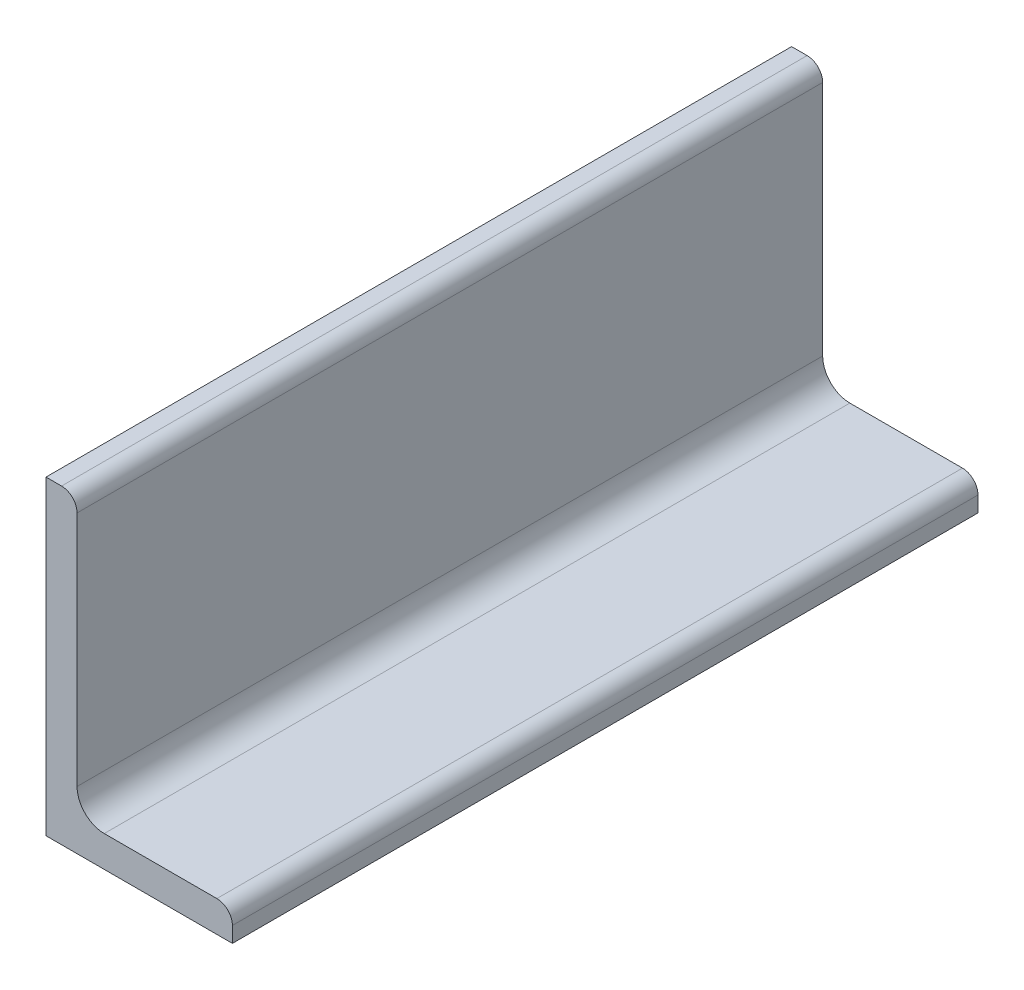
ISO-10303-21;
HEADER;
FILE_DESCRIPTION(('STEP AP214'),'2;1');
FILE_NAME('part.step','',(''),(''),'','','');
FILE_SCHEMA(('AUTOMOTIVE_DESIGN { 1 0 10303 214 1 1 1 1 }'));
ENDSEC;
DATA;
#1=APPLICATION_CONTEXT('core data for automotive mechanical design processes');
#2=APPLICATION_PROTOCOL_DEFINITION('international standard','automotive_design',2000,#1);
#3=PRODUCT_CONTEXT('',#1,'mechanical');
#4=PRODUCT('Part','Part','',(#3));
#5=PRODUCT_RELATED_PRODUCT_CATEGORY('part','',(#4));
#6=PRODUCT_DEFINITION_FORMATION('','',#4);
#7=PRODUCT_DEFINITION_CONTEXT('part definition',#1,'design');
#8=PRODUCT_DEFINITION('design','',#6,#7);
#9=PRODUCT_DEFINITION_SHAPE('','',#8);
#10=(LENGTH_UNIT() NAMED_UNIT(*) SI_UNIT(.MILLI.,.METRE.));
#11=(NAMED_UNIT(*) PLANE_ANGLE_UNIT() SI_UNIT($,.RADIAN.));
#12=(NAMED_UNIT(*) SI_UNIT($,.STERADIAN.) SOLID_ANGLE_UNIT());
#13=UNCERTAINTY_MEASURE_WITH_UNIT(LENGTH_MEASURE(1.E-05),#10,'distance_accuracy_value','');
#14=(GEOMETRIC_REPRESENTATION_CONTEXT(3) GLOBAL_UNCERTAINTY_ASSIGNED_CONTEXT((#13)) GLOBAL_UNIT_ASSIGNED_CONTEXT((#10,
#11,#12)) REPRESENTATION_CONTEXT('',''));
#15=CARTESIAN_POINT('',(0.,0.,0.));
#16=DIRECTION('',(0.,0.,1.));
#17=DIRECTION('',(1.,0.,0.));
#18=AXIS2_PLACEMENT_3D('',#15,#16,#17);
#19=CARTESIAN_POINT('',(0.490776827053332,127.041655270204,304.8));
#20=DIRECTION('',(1.,0.,0.));
#21=DIRECTION('',(0.,0.,-1.));
#22=AXIS2_PLACEMENT_3D('',#19,#20,#21);
#23=PLANE('',#22);
#24=DIRECTION('',(0.,-1.,0.));
#25=VECTOR('',#24,1.);
#26=CARTESIAN_POINT('',(0.490776827053332,127.041655270204,0.));
#27=LINE('',#26,#25);
#28=CARTESIAN_POINT('',(0.490776827053332,127.041655270204,0.));
#29=VERTEX_POINT('',#28);
#30=CARTESIAN_POINT('',(0.490776827053332,0.0416552702040917,0.));
#31=VERTEX_POINT('',#30);
#32=EDGE_CURVE('E135',#29,#31,#27,.T.);
#33=ORIENTED_EDGE('',*,*,#32,.T.);
#34=DIRECTION('',(0.,0.,-1.));
#35=VECTOR('',#34,1.);
#36=CARTESIAN_POINT('',(0.490776827053332,0.0416552702040917,304.8));
#37=LINE('',#36,#35);
#38=CARTESIAN_POINT('',(0.490776827053332,0.0416552702040917,304.8));
#39=VERTEX_POINT('',#38);
#40=EDGE_CURVE('E11',#39,#31,#37,.T.);
#41=ORIENTED_EDGE('',*,*,#40,.F.);
#42=DIRECTION('',(0.,-1.,0.));
#43=VECTOR('',#42,1.);
#44=CARTESIAN_POINT('',(0.490776827053332,127.041655270204,304.8));
#45=LINE('',#44,#43);
#46=CARTESIAN_POINT('',(0.490776827053332,127.041655270204,304.8));
#47=VERTEX_POINT('',#46);
#48=EDGE_CURVE('E151',#47,#39,#45,.T.);
#49=ORIENTED_EDGE('',*,*,#48,.F.);
#50=DIRECTION('',(0.,0.,-1.));
#51=VECTOR('',#50,1.);
#52=CARTESIAN_POINT('',(0.490776827053332,127.041655270204,304.8));
#53=LINE('',#52,#51);
#54=EDGE_CURVE('E131',#47,#29,#53,.T.);
#55=ORIENTED_EDGE('',*,*,#54,.T.);
#56=EDGE_LOOP('',(#33,#41,#49,#55));
#57=FACE_BOUND('',#56,.T.);
#58=ADVANCED_FACE('F33',(#57),#23,.F.);
#59=CARTESIAN_POINT('',(0.490776827053332,0.0416552702040917,304.8));
#60=DIRECTION('',(0.,1.,0.));
#61=DIRECTION('',(0.,0.,1.));
#62=AXIS2_PLACEMENT_3D('',#59,#60,#61);
#63=PLANE('',#62);
#64=DIRECTION('',(1.,0.,0.));
#65=VECTOR('',#64,1.);
#66=CARTESIAN_POINT('',(0.490776827053332,0.0416552702040917,0.));
#67=LINE('',#66,#65);
#68=CARTESIAN_POINT('',(76.6907768270533,0.0416552702040917,0.));
#69=VERTEX_POINT('',#68);
#70=EDGE_CURVE('E138',#31,#69,#67,.T.);
#71=ORIENTED_EDGE('',*,*,#70,.T.);
#72=DIRECTION('',(0.,0.,-1.));
#73=VECTOR('',#72,1.);
#74=CARTESIAN_POINT('',(76.6907768270533,0.0416552702040917,304.8));
#75=LINE('',#74,#73);
#76=CARTESIAN_POINT('',(76.6907768270533,0.0416552702040917,304.8));
#77=VERTEX_POINT('',#76);
#78=EDGE_CURVE('E41',#77,#69,#75,.T.);
#79=ORIENTED_EDGE('',*,*,#78,.F.);
#80=DIRECTION('',(1.,0.,0.));
#81=VECTOR('',#80,1.);
#82=CARTESIAN_POINT('',(0.490776827053332,0.0416552702040917,304.8));
#83=LINE('',#82,#81);
#84=EDGE_CURVE('E95',#39,#77,#83,.T.);
#85=ORIENTED_EDGE('',*,*,#84,.F.);
#86=ORIENTED_EDGE('',*,*,#40,.T.);
#87=EDGE_LOOP('',(#71,#79,#85,#86));
#88=FACE_BOUND('',#87,.T.);
#89=ADVANCED_FACE('F194',(#88),#63,.F.);
#90=CARTESIAN_POINT('',(76.6907768270533,0.0416552702040917,304.8));
#91=DIRECTION('',(-1.,0.,0.));
#92=DIRECTION('',(0.,0.,1.));
#93=AXIS2_PLACEMENT_3D('',#90,#91,#92);
#94=PLANE('',#93);
#95=DIRECTION('',(0.,1.,0.));
#96=VECTOR('',#95,1.);
#97=CARTESIAN_POINT('',(76.6907768270533,0.0416552702040917,0.));
#98=LINE('',#97,#96);
#99=CARTESIAN_POINT('',(76.6907768270533,6.39165527020409,0.));
#100=VERTEX_POINT('',#99);
#101=EDGE_CURVE('E140',#69,#100,#98,.T.);
#102=ORIENTED_EDGE('',*,*,#101,.T.);
#103=DIRECTION('',(0.,0.,-1.));
#104=VECTOR('',#103,1.);
#105=CARTESIAN_POINT('',(76.6907768270533,6.39165527020409,304.8));
#106=LINE('',#105,#104);
#107=CARTESIAN_POINT('',(76.6907768270533,6.39165527020409,304.8));
#108=VERTEX_POINT('',#107);
#109=EDGE_CURVE('E161',#108,#100,#106,.T.);
#110=ORIENTED_EDGE('',*,*,#109,.F.);
#111=DIRECTION('',(0.,1.,0.));
#112=VECTOR('',#111,1.);
#113=CARTESIAN_POINT('',(76.6907768270533,0.0416552702040917,304.8));
#114=LINE('',#113,#112);
#115=EDGE_CURVE('E169',#77,#108,#114,.T.);
#116=ORIENTED_EDGE('',*,*,#115,.F.);
#117=ORIENTED_EDGE('',*,*,#78,.T.);
#118=EDGE_LOOP('',(#102,#110,#116,#117));
#119=FACE_BOUND('',#118,.T.);
#120=ADVANCED_FACE('F167',(#119),#94,.F.);
#121=CARTESIAN_POINT('',(70.3407768270533,6.39165527020409,304.8));
#122=DIRECTION('',(0.,0.,-1.));
#123=DIRECTION('',(-1.,0.,0.));
#124=AXIS2_PLACEMENT_3D('',#121,#122,#123);
#125=CYLINDRICAL_SURFACE('',#124,6.35);
#126=CARTESIAN_POINT('',(70.3407768270533,6.39165527020409,0.));
#127=DIRECTION('',(0.,0.,1.));
#128=DIRECTION('',(1.,0.,0.));
#129=AXIS2_PLACEMENT_3D('',#126,#127,#128);
#130=CIRCLE('',#129,6.35);
#131=CARTESIAN_POINT('',(70.3407768270533,12.7416552702041,0.));
#132=VERTEX_POINT('',#131);
#133=EDGE_CURVE('E142',#100,#132,#130,.T.);
#134=ORIENTED_EDGE('',*,*,#133,.T.);
#135=DIRECTION('',(0.,0.,-1.));
#136=VECTOR('',#135,1.);
#137=CARTESIAN_POINT('',(70.3407768270533,12.7416552702041,304.8));
#138=LINE('',#137,#136);
#139=CARTESIAN_POINT('',(70.3407768270533,12.7416552702041,304.8));
#140=VERTEX_POINT('',#139);
#141=EDGE_CURVE('E158',#140,#132,#138,.T.);
#142=ORIENTED_EDGE('',*,*,#141,.F.);
#143=CARTESIAN_POINT('',(70.3407768270533,6.39165527020409,304.8));
#144=DIRECTION('',(0.,0.,1.));
#145=DIRECTION('',(1.,0.,0.));
#146=AXIS2_PLACEMENT_3D('',#143,#144,#145);
#147=CIRCLE('',#146,6.35);
#148=EDGE_CURVE('E185',#108,#140,#147,.T.);
#149=ORIENTED_EDGE('',*,*,#148,.F.);
#150=ORIENTED_EDGE('',*,*,#109,.T.);
#151=EDGE_LOOP('',(#134,#142,#149,#150));
#152=FACE_BOUND('',#151,.T.);
#153=ADVANCED_FACE('F178',(#152),#125,.T.);
#154=CARTESIAN_POINT('',(70.3407768270533,12.7416552702041,304.8));
#155=DIRECTION('',(0.,-1.,0.));
#156=DIRECTION('',(0.,0.,-1.));
#157=AXIS2_PLACEMENT_3D('',#154,#155,#156);
#158=PLANE('',#157);
#159=DIRECTION('',(-1.,0.,0.));
#160=VECTOR('',#159,1.);
#161=CARTESIAN_POINT('',(70.3407768270533,12.7416552702041,0.));
#162=LINE('',#161,#160);
#163=CARTESIAN_POINT('',(24.3032768270533,12.7416552702041,0.));
#164=VERTEX_POINT('',#163);
#165=EDGE_CURVE('E144',#132,#164,#162,.T.);
#166=ORIENTED_EDGE('',*,*,#165,.T.);
#167=DIRECTION('',(0.,0.,-1.));
#168=VECTOR('',#167,1.);
#169=CARTESIAN_POINT('',(24.3032768270533,12.7416552702041,304.8));
#170=LINE('',#169,#168);
#171=CARTESIAN_POINT('',(24.3032768270533,12.7416552702041,304.8));
#172=VERTEX_POINT('',#171);
#173=EDGE_CURVE('E155',#172,#164,#170,.T.);
#174=ORIENTED_EDGE('',*,*,#173,.F.);
#175=DIRECTION('',(-1.,0.,0.));
#176=VECTOR('',#175,1.);
#177=CARTESIAN_POINT('',(70.3407768270533,12.7416552702041,304.8));
#178=LINE('',#177,#176);
#179=EDGE_CURVE('E184',#140,#172,#178,.T.);
#180=ORIENTED_EDGE('',*,*,#179,.F.);
#181=ORIENTED_EDGE('',*,*,#141,.T.);
#182=EDGE_LOOP('',(#166,#174,#180,#181));
#183=FACE_BOUND('',#182,.T.);
#184=ADVANCED_FACE('F182',(#183),#158,.F.);
#185=CARTESIAN_POINT('',(24.3032768270533,23.8541552702041,304.8));
#186=DIRECTION('',(0.,0.,-1.));
#187=DIRECTION('',(-1.,0.,0.));
#188=AXIS2_PLACEMENT_3D('',#185,#186,#187);
#189=CYLINDRICAL_SURFACE('',#188,11.1125);
#190=CARTESIAN_POINT('',(24.3032768270533,23.8541552702041,0.));
#191=DIRECTION('',(0.,0.,-1.));
#192=DIRECTION('',(1.,0.,0.));
#193=AXIS2_PLACEMENT_3D('',#190,#191,#192);
#194=CIRCLE('',#193,11.1125);
#195=CARTESIAN_POINT('',(13.1907768270533,23.8541552702041,0.));
#196=VERTEX_POINT('',#195);
#197=EDGE_CURVE('E146',#164,#196,#194,.T.);
#198=ORIENTED_EDGE('',*,*,#197,.T.);
#199=DIRECTION('',(0.,0.,-1.));
#200=VECTOR('',#199,1.);
#201=CARTESIAN_POINT('',(13.1907768270533,23.8541552702041,304.8));
#202=LINE('',#201,#200);
#203=CARTESIAN_POINT('',(13.1907768270533,23.8541552702041,304.8));
#204=VERTEX_POINT('',#203);
#205=EDGE_CURVE('E126',#204,#196,#202,.T.);
#206=ORIENTED_EDGE('',*,*,#205,.F.);
#207=CARTESIAN_POINT('',(24.3032768270533,23.8541552702041,304.8));
#208=DIRECTION('',(0.,0.,-1.));
#209=DIRECTION('',(1.,0.,0.));
#210=AXIS2_PLACEMENT_3D('',#207,#208,#209);
#211=CIRCLE('',#210,11.1125);
#212=EDGE_CURVE('E117',#172,#204,#211,.T.);
#213=ORIENTED_EDGE('',*,*,#212,.F.);
#214=ORIENTED_EDGE('',*,*,#173,.T.);
#215=EDGE_LOOP('',(#198,#206,#213,#214));
#216=FACE_BOUND('',#215,.T.);
#217=ADVANCED_FACE('F206',(#216),#189,.F.);
#218=CARTESIAN_POINT('',(13.1907768270533,23.8541552702041,304.8));
#219=DIRECTION('',(-1.,0.,0.));
#220=DIRECTION('',(0.,0.,1.));
#221=AXIS2_PLACEMENT_3D('',#218,#219,#220);
#222=PLANE('',#221);
#223=DIRECTION('',(0.,1.,0.));
#224=VECTOR('',#223,1.);
#225=CARTESIAN_POINT('',(13.1907768270533,23.8541552702041,0.));
#226=LINE('',#225,#224);
#227=CARTESIAN_POINT('',(13.1907768270533,120.691655270204,0.));
#228=VERTEX_POINT('',#227);
#229=EDGE_CURVE('E125',#196,#228,#226,.T.);
#230=ORIENTED_EDGE('',*,*,#229,.T.);
#231=DIRECTION('',(0.,0.,-1.));
#232=VECTOR('',#231,1.);
#233=CARTESIAN_POINT('',(13.1907768270533,120.691655270204,304.8));
#234=LINE('',#233,#232);
#235=CARTESIAN_POINT('',(13.1907768270533,120.691655270204,304.8));
#236=VERTEX_POINT('',#235);
#237=EDGE_CURVE('E122',#236,#228,#234,.T.);
#238=ORIENTED_EDGE('',*,*,#237,.F.);
#239=DIRECTION('',(0.,1.,0.));
#240=VECTOR('',#239,1.);
#241=CARTESIAN_POINT('',(13.1907768270533,23.8541552702041,304.8));
#242=LINE('',#241,#240);
#243=EDGE_CURVE('E111',#204,#236,#242,.T.);
#244=ORIENTED_EDGE('',*,*,#243,.F.);
#245=ORIENTED_EDGE('',*,*,#205,.T.);
#246=EDGE_LOOP('',(#230,#238,#244,#245));
#247=FACE_BOUND('',#246,.T.);
#248=ADVANCED_FACE('F123',(#247),#222,.F.);
#249=CARTESIAN_POINT('',(6.84077682705334,120.691655270204,304.8));
#250=DIRECTION('',(0.,0.,-1.));
#251=DIRECTION('',(-1.,0.,0.));
#252=AXIS2_PLACEMENT_3D('',#249,#250,#251);
#253=CYLINDRICAL_SURFACE('',#252,6.35);
#254=CARTESIAN_POINT('',(6.84077682705334,120.691655270204,0.));
#255=DIRECTION('',(0.,0.,1.));
#256=DIRECTION('',(1.,0.,0.));
#257=AXIS2_PLACEMENT_3D('',#254,#255,#256);
#258=CIRCLE('',#257,6.35);
#259=CARTESIAN_POINT('',(6.84077682705333,127.041655270204,0.));
#260=VERTEX_POINT('',#259);
#261=EDGE_CURVE('E81',#228,#260,#258,.T.);
#262=ORIENTED_EDGE('',*,*,#261,.T.);
#263=DIRECTION('',(0.,0.,-1.));
#264=VECTOR('',#263,1.);
#265=CARTESIAN_POINT('',(6.84077682705333,127.041655270204,304.8));
#266=LINE('',#265,#264);
#267=CARTESIAN_POINT('',(6.84077682705333,127.041655270204,304.8));
#268=VERTEX_POINT('',#267);
#269=EDGE_CURVE('E127',#268,#260,#266,.T.);
#270=ORIENTED_EDGE('',*,*,#269,.F.);
#271=CARTESIAN_POINT('',(6.84077682705334,120.691655270204,304.8));
#272=DIRECTION('',(0.,0.,1.));
#273=DIRECTION('',(1.,0.,0.));
#274=AXIS2_PLACEMENT_3D('',#271,#272,#273);
#275=CIRCLE('',#274,6.35);
#276=EDGE_CURVE('E115',#236,#268,#275,.T.);
#277=ORIENTED_EDGE('',*,*,#276,.F.);
#278=ORIENTED_EDGE('',*,*,#237,.T.);
#279=EDGE_LOOP('',(#262,#270,#277,#278));
#280=FACE_BOUND('',#279,.T.);
#281=ADVANCED_FACE('F129',(#280),#253,.T.);
#282=CARTESIAN_POINT('',(6.84077682705333,127.041655270204,304.8));
#283=DIRECTION('',(0.,-1.,0.));
#284=DIRECTION('',(0.,0.,-1.));
#285=AXIS2_PLACEMENT_3D('',#282,#283,#284);
#286=PLANE('',#285);
#287=DIRECTION('',(-1.,0.,0.));
#288=VECTOR('',#287,1.);
#289=CARTESIAN_POINT('',(6.84077682705333,127.041655270204,0.));
#290=LINE('',#289,#288);
#291=EDGE_CURVE('E87',#260,#29,#290,.T.);
#292=ORIENTED_EDGE('',*,*,#291,.T.);
#293=ORIENTED_EDGE('',*,*,#54,.F.);
#294=DIRECTION('',(-1.,0.,0.));
#295=VECTOR('',#294,1.);
#296=CARTESIAN_POINT('',(6.84077682705333,127.041655270204,304.8));
#297=LINE('',#296,#295);
#298=EDGE_CURVE('E49',#268,#47,#297,.T.);
#299=ORIENTED_EDGE('',*,*,#298,.F.);
#300=ORIENTED_EDGE('',*,*,#269,.T.);
#301=EDGE_LOOP('',(#292,#293,#299,#300));
#302=FACE_BOUND('',#301,.T.);
#303=ADVANCED_FACE('F214',(#302),#286,.F.);
#304=CARTESIAN_POINT('',(70.3407768270533,6.39165527020409,304.8));
#305=DIRECTION('',(0.,0.,1.));
#306=DIRECTION('',(1.,0.,0.));
#307=AXIS2_PLACEMENT_3D('',#304,#305,#306);
#308=PLANE('',#307);
#309=ORIENTED_EDGE('',*,*,#48,.T.);
#310=ORIENTED_EDGE('',*,*,#84,.T.);
#311=ORIENTED_EDGE('',*,*,#115,.T.);
#312=ORIENTED_EDGE('',*,*,#148,.T.);
#313=ORIENTED_EDGE('',*,*,#179,.T.);
#314=ORIENTED_EDGE('',*,*,#212,.T.);
#315=ORIENTED_EDGE('',*,*,#243,.T.);
#316=ORIENTED_EDGE('',*,*,#276,.T.);
#317=ORIENTED_EDGE('',*,*,#298,.T.);
#318=EDGE_LOOP('',(#309,#310,#311,#312,#313,#314,#315,#316,#317));
#319=FACE_BOUND('',#318,.T.);
#320=ADVANCED_FACE('F113',(#319),#308,.T.);
#321=CARTESIAN_POINT('',(70.3407768270533,6.39165527020409,0.));
#322=DIRECTION('',(0.,0.,1.));
#323=DIRECTION('',(1.,0.,0.));
#324=AXIS2_PLACEMENT_3D('',#321,#322,#323);
#325=PLANE('',#324);
#326=ORIENTED_EDGE('',*,*,#32,.F.);
#327=ORIENTED_EDGE('',*,*,#291,.F.);
#328=ORIENTED_EDGE('',*,*,#261,.F.);
#329=ORIENTED_EDGE('',*,*,#229,.F.);
#330=ORIENTED_EDGE('',*,*,#197,.F.);
#331=ORIENTED_EDGE('',*,*,#165,.F.);
#332=ORIENTED_EDGE('',*,*,#133,.F.);
#333=ORIENTED_EDGE('',*,*,#101,.F.);
#334=ORIENTED_EDGE('',*,*,#70,.F.);
#335=EDGE_LOOP('',(#326,#327,#328,#329,#330,#331,#332,#333,#334));
#336=FACE_BOUND('',#335,.T.);
#337=ADVANCED_FACE('F173',(#336),#325,.F.);
#338=CLOSED_SHELL('',(#58,#89,#120,#153,#184,#217,#248,#281,#303,#320,#337));
#339=MANIFOLD_SOLID_BREP('B2',#338);
#340=ADVANCED_BREP_SHAPE_REPRESENTATION('',(#18,#339),#14);
#341=SHAPE_DEFINITION_REPRESENTATION(#9,#340);
ENDSEC;
END-ISO-10303-21;
